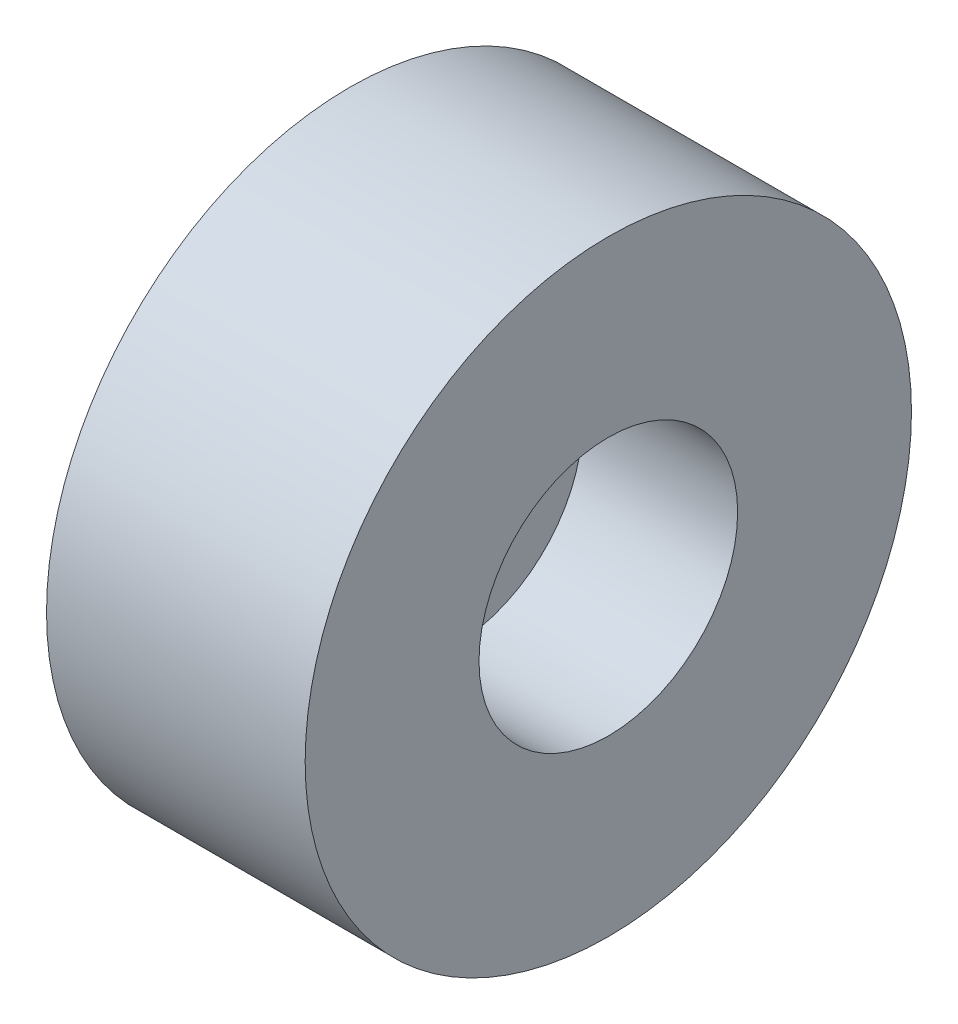
ISO-10303-21;
HEADER;
FILE_DESCRIPTION(('STEP AP214'),'2;1');
FILE_NAME('part.step','',(''),(''),'','','');
FILE_SCHEMA(('AUTOMOTIVE_DESIGN { 1 0 10303 214 1 1 1 1 }'));
ENDSEC;
DATA;
#1=APPLICATION_CONTEXT('core data for automotive mechanical design processes');
#2=APPLICATION_PROTOCOL_DEFINITION('international standard','automotive_design',2000,#1);
#3=PRODUCT_CONTEXT('',#1,'mechanical');
#4=PRODUCT('Part','Part','',(#3));
#5=PRODUCT_RELATED_PRODUCT_CATEGORY('part','',(#4));
#6=PRODUCT_DEFINITION_FORMATION('','',#4);
#7=PRODUCT_DEFINITION_CONTEXT('part definition',#1,'design');
#8=PRODUCT_DEFINITION('design','',#6,#7);
#9=PRODUCT_DEFINITION_SHAPE('','',#8);
#10=(LENGTH_UNIT() NAMED_UNIT(*) SI_UNIT(.MILLI.,.METRE.));
#11=(NAMED_UNIT(*) PLANE_ANGLE_UNIT() SI_UNIT($,.RADIAN.));
#12=(NAMED_UNIT(*) SI_UNIT($,.STERADIAN.) SOLID_ANGLE_UNIT());
#13=UNCERTAINTY_MEASURE_WITH_UNIT(LENGTH_MEASURE(1.E-05),#10,'distance_accuracy_value','');
#14=(GEOMETRIC_REPRESENTATION_CONTEXT(3) GLOBAL_UNCERTAINTY_ASSIGNED_CONTEXT((#13)) GLOBAL_UNIT_ASSIGNED_CONTEXT((#10,
#11,#12)) REPRESENTATION_CONTEXT('',''));
#15=CARTESIAN_POINT('',(0.,0.,0.));
#16=DIRECTION('',(0.,0.,1.));
#17=DIRECTION('',(1.,0.,0.));
#18=AXIS2_PLACEMENT_3D('',#15,#16,#17);
#19=CARTESIAN_POINT('',(-9.91475753821234,-0.999999999999999,0.));
#20=DIRECTION('',(-1.,0.,0.));
#21=DIRECTION('',(0.,0.,1.));
#22=AXIS2_PLACEMENT_3D('',#19,#20,#21);
#23=PLANE('',#22);
#24=CARTESIAN_POINT('',(-9.91475753821234,0.,0.));
#25=DIRECTION('',(-1.,0.,0.));
#26=DIRECTION('',(0.,0.,1.));
#27=AXIS2_PLACEMENT_3D('',#24,#25,#26);
#28=CIRCLE('',#27,5.86065573770491);
#29=CARTESIAN_POINT('',(-9.91475753821234,0.,5.86065573770491));
#30=VERTEX_POINT('',#29);
#31=EDGE_CURVE('E10',#30,#30,#28,.T.);
#32=ORIENTED_EDGE('',*,*,#31,.T.);
#33=EDGE_LOOP('',(#32));
#34=FACE_BOUND('',#33,.T.);
#35=CARTESIAN_POINT('',(-9.91475753821234,0.,0.));
#36=DIRECTION('',(-1.,0.,0.));
#37=DIRECTION('',(0.,0.,1.));
#38=AXIS2_PLACEMENT_3D('',#35,#36,#37);
#39=CIRCLE('',#38,0.999999999999999);
#40=CARTESIAN_POINT('',(-9.91475753821234,0.,0.999999999999999));
#41=VERTEX_POINT('',#40);
#42=EDGE_CURVE('E70',#41,#41,#39,.T.);
#43=ORIENTED_EDGE('',*,*,#42,.F.);
#44=EDGE_LOOP('',(#43));
#45=FACE_BOUND('',#44,.T.);
#46=ADVANCED_FACE('F43',(#34,#45),#23,.T.);
#47=CARTESIAN_POINT('',(-14.3886690574988,0.,0.));
#48=DIRECTION('',(-1.,0.,0.));
#49=DIRECTION('',(0.,0.,1.));
#50=AXIS2_PLACEMENT_3D('',#47,#48,#49);
#51=CYLINDRICAL_SURFACE('',#50,5.86065573770491);
#52=CARTESIAN_POINT('',(-4.91475753821234,0.,0.));
#53=DIRECTION('',(-1.,0.,0.));
#54=DIRECTION('',(0.,0.,1.));
#55=AXIS2_PLACEMENT_3D('',#52,#53,#54);
#56=CIRCLE('',#55,5.86065573770491);
#57=CARTESIAN_POINT('',(-4.91475753821234,0.,5.86065573770491));
#58=VERTEX_POINT('',#57);
#59=EDGE_CURVE('E50',#58,#58,#56,.T.);
#60=ORIENTED_EDGE('',*,*,#59,.T.);
#61=EDGE_LOOP('',(#60));
#62=FACE_BOUND('',#61,.T.);
#63=ORIENTED_EDGE('',*,*,#31,.F.);
#64=EDGE_LOOP('',(#63));
#65=FACE_BOUND('',#64,.T.);
#66=ADVANCED_FACE('F79',(#62,#65),#51,.T.);
#67=CARTESIAN_POINT('',(-4.91475753821234,-5.86065573770491,0.));
#68=DIRECTION('',(1.,0.,0.));
#69=DIRECTION('',(0.,0.,-1.));
#70=AXIS2_PLACEMENT_3D('',#67,#68,#69);
#71=PLANE('',#70);
#72=CARTESIAN_POINT('',(-4.91475753821234,0.,0.));
#73=DIRECTION('',(-1.,0.,0.));
#74=DIRECTION('',(0.,0.,1.));
#75=AXIS2_PLACEMENT_3D('',#72,#73,#74);
#76=CIRCLE('',#75,2.5);
#77=CARTESIAN_POINT('',(-4.91475753821234,0.,2.5));
#78=VERTEX_POINT('',#77);
#79=EDGE_CURVE('E55',#78,#78,#76,.T.);
#80=ORIENTED_EDGE('',*,*,#79,.T.);
#81=EDGE_LOOP('',(#80));
#82=FACE_BOUND('',#81,.T.);
#83=ORIENTED_EDGE('',*,*,#59,.F.);
#84=EDGE_LOOP('',(#83));
#85=FACE_BOUND('',#84,.T.);
#86=ADVANCED_FACE('F83',(#82,#85),#71,.T.);
#87=CARTESIAN_POINT('',(-14.3886690574988,0.,0.));
#88=DIRECTION('',(-1.,0.,0.));
#89=DIRECTION('',(0.,0.,1.));
#90=AXIS2_PLACEMENT_3D('',#87,#88,#89);
#91=CYLINDRICAL_SURFACE('',#90,2.5);
#92=CARTESIAN_POINT('',(-7.91475753821234,0.,0.));
#93=DIRECTION('',(-1.,0.,0.));
#94=DIRECTION('',(0.,0.,1.));
#95=AXIS2_PLACEMENT_3D('',#92,#93,#94);
#96=CIRCLE('',#95,2.5);
#97=CARTESIAN_POINT('',(-7.91475753821234,0.,2.5));
#98=VERTEX_POINT('',#97);
#99=EDGE_CURVE('E60',#98,#98,#96,.T.);
#100=ORIENTED_EDGE('',*,*,#99,.T.);
#101=EDGE_LOOP('',(#100));
#102=FACE_BOUND('',#101,.T.);
#103=ORIENTED_EDGE('',*,*,#79,.F.);
#104=EDGE_LOOP('',(#103));
#105=FACE_BOUND('',#104,.T.);
#106=ADVANCED_FACE('F87',(#102,#105),#91,.F.);
#107=CARTESIAN_POINT('',(-7.91475753821234,-2.5,0.));
#108=DIRECTION('',(1.,0.,0.));
#109=DIRECTION('',(0.,0.,-1.));
#110=AXIS2_PLACEMENT_3D('',#107,#108,#109);
#111=PLANE('',#110);
#112=CARTESIAN_POINT('',(-7.91475753821234,0.,0.));
#113=DIRECTION('',(-1.,0.,0.));
#114=DIRECTION('',(0.,0.,1.));
#115=AXIS2_PLACEMENT_3D('',#112,#113,#114);
#116=CIRCLE('',#115,0.999999999999999);
#117=CARTESIAN_POINT('',(-7.91475753821234,0.,0.999999999999999));
#118=VERTEX_POINT('',#117);
#119=EDGE_CURVE('E66',#118,#118,#116,.T.);
#120=ORIENTED_EDGE('',*,*,#119,.T.);
#121=EDGE_LOOP('',(#120));
#122=FACE_BOUND('',#121,.T.);
#123=ORIENTED_EDGE('',*,*,#99,.F.);
#124=EDGE_LOOP('',(#123));
#125=FACE_BOUND('',#124,.T.);
#126=ADVANCED_FACE('F94',(#122,#125),#111,.T.);
#127=CARTESIAN_POINT('',(-14.3886690574988,0.,0.));
#128=DIRECTION('',(-1.,0.,0.));
#129=DIRECTION('',(0.,0.,1.));
#130=AXIS2_PLACEMENT_3D('',#127,#128,#129);
#131=CYLINDRICAL_SURFACE('',#130,0.999999999999999);
#132=ORIENTED_EDGE('',*,*,#42,.T.);
#133=EDGE_LOOP('',(#132));
#134=FACE_BOUND('',#133,.T.);
#135=ORIENTED_EDGE('',*,*,#119,.F.);
#136=EDGE_LOOP('',(#135));
#137=FACE_BOUND('',#136,.T.);
#138=ADVANCED_FACE('F75',(#134,#137),#131,.F.);
#139=CLOSED_SHELL('',(#46,#66,#86,#106,#126,#138));
#140=MANIFOLD_SOLID_BREP('B2',#139);
#141=ADVANCED_BREP_SHAPE_REPRESENTATION('',(#18,#140),#14);
#142=SHAPE_DEFINITION_REPRESENTATION(#9,#141);
ENDSEC;
END-ISO-10303-21;
